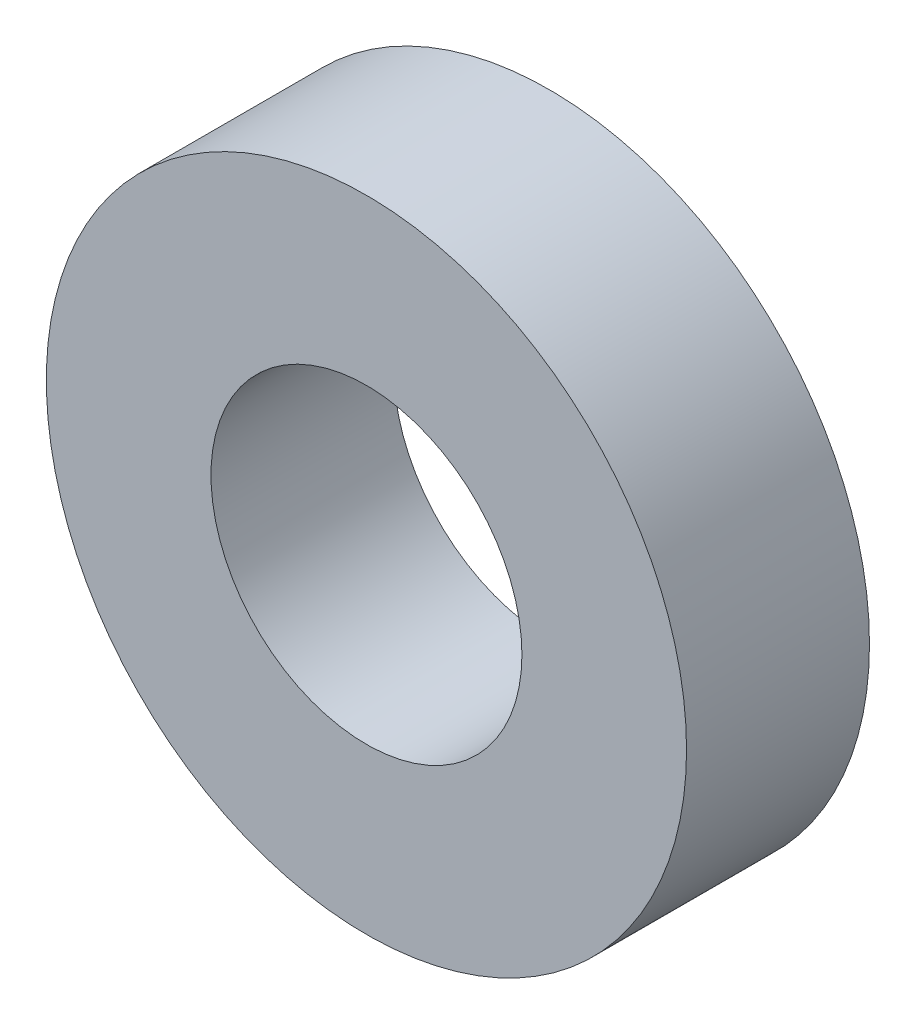
ISO-10303-21;
HEADER;
FILE_DESCRIPTION(('STEP AP214'),'2;1');
FILE_NAME('part.step','',(''),(''),'','','');
FILE_SCHEMA(('AUTOMOTIVE_DESIGN { 1 0 10303 214 1 1 1 1 }'));
ENDSEC;
DATA;
#1=APPLICATION_CONTEXT('core data for automotive mechanical design processes');
#2=APPLICATION_PROTOCOL_DEFINITION('international standard','automotive_design',2000,#1);
#3=PRODUCT_CONTEXT('',#1,'mechanical');
#4=PRODUCT('Part','Part','',(#3));
#5=PRODUCT_RELATED_PRODUCT_CATEGORY('part','',(#4));
#6=PRODUCT_DEFINITION_FORMATION('','',#4);
#7=PRODUCT_DEFINITION_CONTEXT('part definition',#1,'design');
#8=PRODUCT_DEFINITION('design','',#6,#7);
#9=PRODUCT_DEFINITION_SHAPE('','',#8);
#10=(LENGTH_UNIT() NAMED_UNIT(*) SI_UNIT(.MILLI.,.METRE.));
#11=(NAMED_UNIT(*) PLANE_ANGLE_UNIT() SI_UNIT($,.RADIAN.));
#12=(NAMED_UNIT(*) SI_UNIT($,.STERADIAN.) SOLID_ANGLE_UNIT());
#13=UNCERTAINTY_MEASURE_WITH_UNIT(LENGTH_MEASURE(1.E-05),#10,'distance_accuracy_value','');
#14=(GEOMETRIC_REPRESENTATION_CONTEXT(3) GLOBAL_UNCERTAINTY_ASSIGNED_CONTEXT((#13)) GLOBAL_UNIT_ASSIGNED_CONTEXT((#10,
#11,#12)) REPRESENTATION_CONTEXT('',''));
#15=CARTESIAN_POINT('',(0.,0.,0.));
#16=DIRECTION('',(0.,0.,1.));
#17=DIRECTION('',(1.,0.,0.));
#18=AXIS2_PLACEMENT_3D('',#15,#16,#17);
#19=CARTESIAN_POINT('',(0.,0.,-32.));
#20=DIRECTION('',(0.,0.,1.));
#21=DIRECTION('',(1.,0.,0.));
#22=AXIS2_PLACEMENT_3D('',#19,#20,#21);
#23=PLANE('',#22);
#24=CARTESIAN_POINT('',(0.,0.,-32.));
#25=DIRECTION('',(0.,0.,1.));
#26=DIRECTION('',(1.,0.,0.));
#27=AXIS2_PLACEMENT_3D('',#24,#25,#26);
#28=CIRCLE('',#27,17.5);
#29=CARTESIAN_POINT('',(17.5,0.,-32.));
#30=VERTEX_POINT('',#29);
#31=EDGE_CURVE('E10',#30,#30,#28,.T.);
#32=ORIENTED_EDGE('',*,*,#31,.T.);
#33=EDGE_LOOP('',(#32));
#34=FACE_BOUND('',#33,.T.);
#35=CARTESIAN_POINT('',(0.,0.,-32.));
#36=DIRECTION('',(0.,0.,1.));
#37=DIRECTION('',(1.,0.,0.));
#38=AXIS2_PLACEMENT_3D('',#35,#36,#37);
#39=CIRCLE('',#38,8.5);
#40=CARTESIAN_POINT('',(8.5,0.,-32.));
#41=VERTEX_POINT('',#40);
#42=EDGE_CURVE('E50',#41,#41,#39,.T.);
#43=ORIENTED_EDGE('',*,*,#42,.F.);
#44=EDGE_LOOP('',(#43));
#45=FACE_BOUND('',#44,.T.);
#46=ADVANCED_FACE('F36',(#34,#45),#23,.T.);
#47=CARTESIAN_POINT('',(0.,0.,-42.));
#48=DIRECTION('',(0.,0.,1.));
#49=DIRECTION('',(1.,0.,0.));
#50=AXIS2_PLACEMENT_3D('',#47,#48,#49);
#51=PLANE('',#50);
#52=CARTESIAN_POINT('',(0.,0.,-42.));
#53=DIRECTION('',(0.,0.,1.));
#54=DIRECTION('',(1.,0.,0.));
#55=AXIS2_PLACEMENT_3D('',#52,#53,#54);
#56=CIRCLE('',#55,17.5);
#57=CARTESIAN_POINT('',(17.5,0.,-42.));
#58=VERTEX_POINT('',#57);
#59=EDGE_CURVE('E40',#58,#58,#56,.T.);
#60=ORIENTED_EDGE('',*,*,#59,.F.);
#61=EDGE_LOOP('',(#60));
#62=FACE_BOUND('',#61,.T.);
#63=CARTESIAN_POINT('',(0.,0.,-42.));
#64=DIRECTION('',(0.,0.,1.));
#65=DIRECTION('',(1.,0.,0.));
#66=AXIS2_PLACEMENT_3D('',#63,#64,#65);
#67=CIRCLE('',#66,8.5);
#68=CARTESIAN_POINT('',(8.5,0.,-42.));
#69=VERTEX_POINT('',#68);
#70=EDGE_CURVE('E52',#69,#69,#67,.T.);
#71=ORIENTED_EDGE('',*,*,#70,.T.);
#72=EDGE_LOOP('',(#71));
#73=FACE_BOUND('',#72,.T.);
#74=ADVANCED_FACE('F63',(#62,#73),#51,.F.);
#75=CARTESIAN_POINT('',(0.,0.,-32.));
#76=DIRECTION('',(0.,0.,-1.));
#77=DIRECTION('',(-1.,0.,0.));
#78=AXIS2_PLACEMENT_3D('',#75,#76,#77);
#79=CYLINDRICAL_SURFACE('',#78,17.5);
#80=ORIENTED_EDGE('',*,*,#31,.F.);
#81=EDGE_LOOP('',(#80));
#82=FACE_BOUND('',#81,.T.);
#83=ORIENTED_EDGE('',*,*,#59,.T.);
#84=EDGE_LOOP('',(#83));
#85=FACE_BOUND('',#84,.T.);
#86=ADVANCED_FACE('F38',(#82,#85),#79,.T.);
#87=CARTESIAN_POINT('',(0.,0.,-32.));
#88=DIRECTION('',(0.,0.,-1.));
#89=DIRECTION('',(-1.,0.,0.));
#90=AXIS2_PLACEMENT_3D('',#87,#88,#89);
#91=CYLINDRICAL_SURFACE('',#90,8.5);
#92=ORIENTED_EDGE('',*,*,#42,.T.);
#93=EDGE_LOOP('',(#92));
#94=FACE_BOUND('',#93,.T.);
#95=ORIENTED_EDGE('',*,*,#70,.F.);
#96=EDGE_LOOP('',(#95));
#97=FACE_BOUND('',#96,.T.);
#98=ADVANCED_FACE('F59',(#94,#97),#91,.F.);
#99=CLOSED_SHELL('',(#46,#74,#86,#98));
#100=MANIFOLD_SOLID_BREP('B2',#99);
#101=ADVANCED_BREP_SHAPE_REPRESENTATION('',(#18,#100),#14);
#102=SHAPE_DEFINITION_REPRESENTATION(#9,#101);
ENDSEC;
END-ISO-10303-21;
